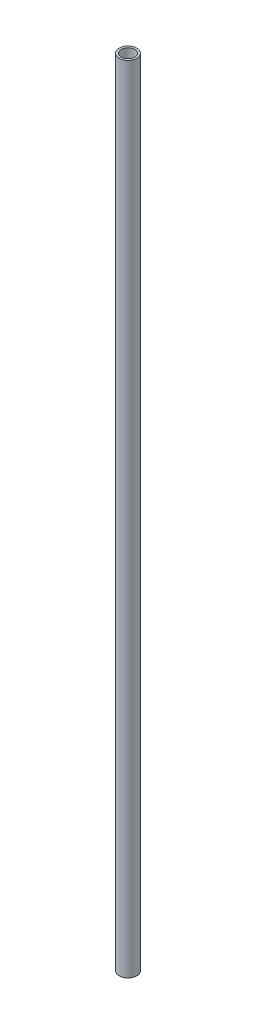
ISO-10303-21;
HEADER;
FILE_DESCRIPTION(('STEP AP214'),'2;1');
FILE_NAME('part.step','',(''),(''),'','','');
FILE_SCHEMA(('AUTOMOTIVE_DESIGN { 1 0 10303 214 1 1 1 1 }'));
ENDSEC;
DATA;
#1=APPLICATION_CONTEXT('core data for automotive mechanical design processes');
#2=APPLICATION_PROTOCOL_DEFINITION('international standard','automotive_design',2000,#1);
#3=PRODUCT_CONTEXT('',#1,'mechanical');
#4=PRODUCT('Part','Part','',(#3));
#5=PRODUCT_RELATED_PRODUCT_CATEGORY('part','',(#4));
#6=PRODUCT_DEFINITION_FORMATION('','',#4);
#7=PRODUCT_DEFINITION_CONTEXT('part definition',#1,'design');
#8=PRODUCT_DEFINITION('design','',#6,#7);
#9=PRODUCT_DEFINITION_SHAPE('','',#8);
#10=(LENGTH_UNIT() NAMED_UNIT(*) SI_UNIT(.MILLI.,.METRE.));
#11=(NAMED_UNIT(*) PLANE_ANGLE_UNIT() SI_UNIT($,.RADIAN.));
#12=(NAMED_UNIT(*) SI_UNIT($,.STERADIAN.) SOLID_ANGLE_UNIT());
#13=UNCERTAINTY_MEASURE_WITH_UNIT(LENGTH_MEASURE(1.E-05),#10,'distance_accuracy_value','');
#14=(GEOMETRIC_REPRESENTATION_CONTEXT(3) GLOBAL_UNCERTAINTY_ASSIGNED_CONTEXT((#13)) GLOBAL_UNIT_ASSIGNED_CONTEXT((#10,
#11,#12)) REPRESENTATION_CONTEXT('',''));
#15=CARTESIAN_POINT('',(0.,0.,0.));
#16=DIRECTION('',(0.,0.,1.));
#17=DIRECTION('',(1.,0.,0.));
#18=AXIS2_PLACEMENT_3D('',#15,#16,#17);
#19=CARTESIAN_POINT('',(0.,1500.,0.));
#20=DIRECTION('',(0.,-1.,0.));
#21=DIRECTION('',(0.,0.,-1.));
#22=AXIS2_PLACEMENT_3D('',#19,#20,#21);
#23=CYLINDRICAL_SURFACE('',#22,16.7);
#24=CARTESIAN_POINT('',(0.,1500.,0.));
#25=DIRECTION('',(0.,1.,0.));
#26=DIRECTION('',(0.,0.,1.));
#27=AXIS2_PLACEMENT_3D('',#24,#25,#26);
#28=CIRCLE('',#27,16.7);
#29=CARTESIAN_POINT('',(0.,1500.,16.7));
#30=VERTEX_POINT('',#29);
#31=EDGE_CURVE('E10',#30,#30,#28,.T.);
#32=ORIENTED_EDGE('',*,*,#31,.F.);
#33=EDGE_LOOP('',(#32));
#34=FACE_BOUND('',#33,.T.);
#35=CARTESIAN_POINT('',(0.,0.,0.));
#36=DIRECTION('',(0.,1.,0.));
#37=DIRECTION('',(0.,0.,1.));
#38=AXIS2_PLACEMENT_3D('',#35,#36,#37);
#39=CIRCLE('',#38,16.7);
#40=CARTESIAN_POINT('',(0.,0.,16.7));
#41=VERTEX_POINT('',#40);
#42=EDGE_CURVE('E38',#41,#41,#39,.T.);
#43=ORIENTED_EDGE('',*,*,#42,.T.);
#44=EDGE_LOOP('',(#43));
#45=FACE_BOUND('',#44,.T.);
#46=ADVANCED_FACE('F35',(#34,#45),#23,.T.);
#47=CARTESIAN_POINT('',(0.,1500.,0.));
#48=DIRECTION('',(0.,1.,0.));
#49=DIRECTION('',(0.,0.,1.));
#50=AXIS2_PLACEMENT_3D('',#47,#48,#49);
#51=PLANE('',#50);
#52=CARTESIAN_POINT('',(0.,1500.,0.));
#53=DIRECTION('',(0.,1.,0.));
#54=DIRECTION('',(0.,0.,1.));
#55=AXIS2_PLACEMENT_3D('',#52,#53,#54);
#56=CIRCLE('',#55,12.7000000000061);
#57=CARTESIAN_POINT('',(0.,1500.,12.7000000000061));
#58=VERTEX_POINT('',#57);
#59=EDGE_CURVE('E47',#58,#58,#56,.T.);
#60=ORIENTED_EDGE('',*,*,#59,.F.);
#61=EDGE_LOOP('',(#60));
#62=FACE_BOUND('',#61,.T.);
#63=ORIENTED_EDGE('',*,*,#31,.T.);
#64=EDGE_LOOP('',(#63));
#65=FACE_BOUND('',#64,.T.);
#66=ADVANCED_FACE('F62',(#62,#65),#51,.T.);
#67=CARTESIAN_POINT('',(0.,0.,0.));
#68=DIRECTION('',(0.,1.,0.));
#69=DIRECTION('',(0.,0.,1.));
#70=AXIS2_PLACEMENT_3D('',#67,#68,#69);
#71=PLANE('',#70);
#72=CARTESIAN_POINT('',(0.,0.,0.));
#73=DIRECTION('',(0.,1.,0.));
#74=DIRECTION('',(0.,0.,1.));
#75=AXIS2_PLACEMENT_3D('',#72,#73,#74);
#76=CIRCLE('',#75,12.7000000000061);
#77=CARTESIAN_POINT('',(0.,0.,12.7000000000061));
#78=VERTEX_POINT('',#77);
#79=EDGE_CURVE('E45',#78,#78,#76,.T.);
#80=ORIENTED_EDGE('',*,*,#79,.T.);
#81=EDGE_LOOP('',(#80));
#82=FACE_BOUND('',#81,.T.);
#83=ORIENTED_EDGE('',*,*,#42,.F.);
#84=EDGE_LOOP('',(#83));
#85=FACE_BOUND('',#84,.T.);
#86=ADVANCED_FACE('F53',(#82,#85),#71,.F.);
#87=CARTESIAN_POINT('',(0.,0.,0.));
#88=DIRECTION('',(0.,1.,0.));
#89=DIRECTION('',(0.,0.,1.));
#90=AXIS2_PLACEMENT_3D('',#87,#88,#89);
#91=CYLINDRICAL_SURFACE('',#90,12.7000000000061);
#92=ORIENTED_EDGE('',*,*,#79,.F.);
#93=EDGE_LOOP('',(#92));
#94=FACE_BOUND('',#93,.T.);
#95=ORIENTED_EDGE('',*,*,#59,.T.);
#96=EDGE_LOOP('',(#95));
#97=FACE_BOUND('',#96,.T.);
#98=ADVANCED_FACE('F56',(#94,#97),#91,.F.);
#99=CLOSED_SHELL('',(#46,#66,#86,#98));
#100=MANIFOLD_SOLID_BREP('B2',#99);
#101=ADVANCED_BREP_SHAPE_REPRESENTATION('',(#18,#100),#14);
#102=SHAPE_DEFINITION_REPRESENTATION(#9,#101);
ENDSEC;
END-ISO-10303-21;
